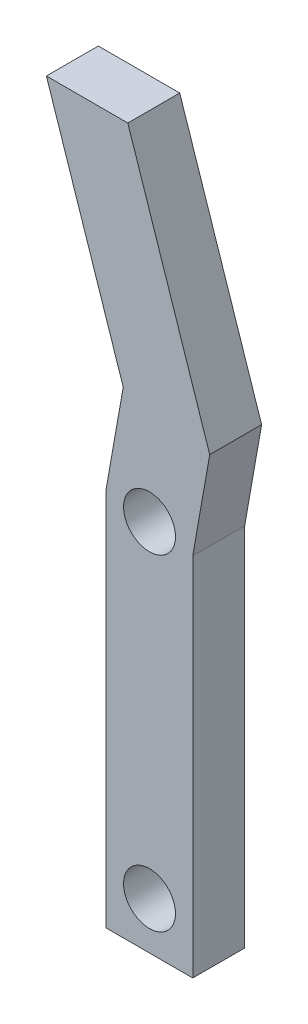
ISO-10303-21;
HEADER;
FILE_DESCRIPTION(('STEP AP214'),'2;1');
FILE_NAME('part.step','',(''),(''),'','','');
FILE_SCHEMA(('AUTOMOTIVE_DESIGN { 1 0 10303 214 1 1 1 1 }'));
ENDSEC;
DATA;
#1=APPLICATION_CONTEXT('core data for automotive mechanical design processes');
#2=APPLICATION_PROTOCOL_DEFINITION('international standard','automotive_design',2000,#1);
#3=PRODUCT_CONTEXT('',#1,'mechanical');
#4=PRODUCT('Part','Part','',(#3));
#5=PRODUCT_RELATED_PRODUCT_CATEGORY('part','',(#4));
#6=PRODUCT_DEFINITION_FORMATION('','',#4);
#7=PRODUCT_DEFINITION_CONTEXT('part definition',#1,'design');
#8=PRODUCT_DEFINITION('design','',#6,#7);
#9=PRODUCT_DEFINITION_SHAPE('','',#8);
#10=(LENGTH_UNIT() NAMED_UNIT(*) SI_UNIT(.MILLI.,.METRE.));
#11=(NAMED_UNIT(*) PLANE_ANGLE_UNIT() SI_UNIT($,.RADIAN.));
#12=(NAMED_UNIT(*) SI_UNIT($,.STERADIAN.) SOLID_ANGLE_UNIT());
#13=UNCERTAINTY_MEASURE_WITH_UNIT(LENGTH_MEASURE(1.E-05),#10,'distance_accuracy_value','');
#14=(GEOMETRIC_REPRESENTATION_CONTEXT(3) GLOBAL_UNCERTAINTY_ASSIGNED_CONTEXT((#13)) GLOBAL_UNIT_ASSIGNED_CONTEXT((#10,
#11,#12)) REPRESENTATION_CONTEXT('',''));
#15=CARTESIAN_POINT('',(0.,0.,0.));
#16=DIRECTION('',(0.,0.,1.));
#17=DIRECTION('',(1.,0.,0.));
#18=AXIS2_PLACEMENT_3D('',#15,#16,#17);
#19=CARTESIAN_POINT('',(0.,0.,3.));
#20=DIRECTION('',(0.,0.,1.));
#21=DIRECTION('',(1.,0.,0.));
#22=AXIS2_PLACEMENT_3D('',#19,#20,#21);
#23=PLANE('',#22);
#24=CARTESIAN_POINT('',(2.5,2.72444415808687,3.));
#25=DIRECTION('',(0.,0.,1.));
#26=DIRECTION('',(1.,0.,0.));
#27=AXIS2_PLACEMENT_3D('',#24,#25,#26);
#28=CIRCLE('',#27,1.5);
#29=CARTESIAN_POINT('',(4.,2.72444415808687,3.));
#30=VERTEX_POINT('',#29);
#31=EDGE_CURVE('E140',#30,#30,#28,.T.);
#32=ORIENTED_EDGE('',*,*,#31,.F.);
#33=EDGE_LOOP('',(#32));
#34=FACE_BOUND('',#33,.T.);
#35=DIRECTION('',(0.,-1.,0.));
#36=VECTOR('',#35,1.);
#37=CARTESIAN_POINT('',(0.,0.,3.));
#38=LINE('',#37,#36);
#39=CARTESIAN_POINT('',(0.,22.,3.));
#40=VERTEX_POINT('',#39);
#41=CARTESIAN_POINT('',(0.,0.,3.));
#42=VERTEX_POINT('',#41);
#43=EDGE_CURVE('E151',#40,#42,#38,.T.);
#44=ORIENTED_EDGE('',*,*,#43,.T.);
#45=DIRECTION('',(1.,0.,0.));
#46=VECTOR('',#45,1.);
#47=CARTESIAN_POINT('',(0.,0.,3.));
#48=LINE('',#47,#46);
#49=CARTESIAN_POINT('',(5.,0.,3.));
#50=VERTEX_POINT('',#49);
#51=EDGE_CURVE('E99',#42,#50,#48,.T.);
#52=ORIENTED_EDGE('',*,*,#51,.T.);
#53=DIRECTION('',(0.,1.,0.));
#54=VECTOR('',#53,1.);
#55=CARTESIAN_POINT('',(5.,0.,3.));
#56=LINE('',#55,#54);
#57=CARTESIAN_POINT('',(5.,21.1275355700729,3.));
#58=VERTEX_POINT('',#57);
#59=EDGE_CURVE('E166',#50,#58,#56,.T.);
#60=ORIENTED_EDGE('',*,*,#59,.T.);
#61=DIRECTION('',(0.173648177666923,0.984807753012209,0.));
#62=VECTOR('',#61,1.);
#63=CARTESIAN_POINT('',(5.98037801273902,26.6875355700729,3.));
#64=LINE('',#63,#62);
#65=CARTESIAN_POINT('',(5.98037801273902,26.6875355700729,3.));
#66=VERTEX_POINT('',#65);
#67=EDGE_CURVE('E179',#58,#66,#64,.T.);
#68=ORIENTED_EDGE('',*,*,#67,.T.);
#69=DIRECTION('',(-0.315548549180051,0.948909433565904,0.));
#70=VECTOR('',#69,1.);
#71=CARTESIAN_POINT('',(5.98037801273902,26.6875355700729,3.));
#72=LINE('',#71,#70);
#73=CARTESIAN_POINT('',(1.24714977503826,40.9211770735615,3.));
#74=VERTEX_POINT('',#73);
#75=EDGE_CURVE('E118',#66,#74,#72,.T.);
#76=ORIENTED_EDGE('',*,*,#75,.T.);
#77=DIRECTION('',(-1.,0.,0.));
#78=VECTOR('',#77,1.);
#79=CARTESIAN_POINT('',(1.24714977503826,40.9211770735615,3.));
#80=LINE('',#79,#78);
#81=CARTESIAN_POINT('',(-3.46008988293387,40.9211770735615,3.));
#82=VERTEX_POINT('',#81);
#83=EDGE_CURVE('E112',#74,#82,#80,.T.);
#84=ORIENTED_EDGE('',*,*,#83,.T.);
#85=DIRECTION('',(0.315548549180051,-0.948909433565904,0.));
#86=VECTOR('',#85,1.);
#87=CARTESIAN_POINT('',(0.980378012739025,27.5679168966425,3.));
#88=LINE('',#87,#86);
#89=CARTESIAN_POINT('',(0.980378012739025,27.5679168966425,3.));
#90=VERTEX_POINT('',#89);
#91=EDGE_CURVE('E116',#82,#90,#88,.T.);
#92=ORIENTED_EDGE('',*,*,#91,.T.);
#93=DIRECTION('',(-0.173408700949356,-0.984849949197875,0.));
#94=VECTOR('',#93,1.);
#95=CARTESIAN_POINT('',(0.,22.,3.));
#96=LINE('',#95,#94);
#97=EDGE_CURVE('E56',#90,#40,#96,.T.);
#98=ORIENTED_EDGE('',*,*,#97,.T.);
#99=EDGE_LOOP('',(#44,#52,#60,#68,#76,#84,#92,#98));
#100=FACE_BOUND('',#99,.T.);
#101=CARTESIAN_POINT('',(2.5,21.5844441580869,3.));
#102=DIRECTION('',(0.,0.,1.));
#103=DIRECTION('',(1.,0.,0.));
#104=AXIS2_PLACEMENT_3D('',#101,#102,#103);
#105=CIRCLE('',#104,1.5);
#106=CARTESIAN_POINT('',(4.00000000000001,21.5844441580869,3.));
#107=VERTEX_POINT('',#106);
#108=EDGE_CURVE('E188',#107,#107,#105,.T.);
#109=ORIENTED_EDGE('',*,*,#108,.F.);
#110=EDGE_LOOP('',(#109));
#111=FACE_BOUND('',#110,.T.);
#112=ADVANCED_FACE('F39',(#34,#100,#111),#23,.T.);
#113=CARTESIAN_POINT('',(0.,0.,0.));
#114=DIRECTION('',(0.,0.,1.));
#115=DIRECTION('',(1.,0.,0.));
#116=AXIS2_PLACEMENT_3D('',#113,#114,#115);
#117=PLANE('',#116);
#118=DIRECTION('',(0.,-1.,0.));
#119=VECTOR('',#118,1.);
#120=CARTESIAN_POINT('',(0.,0.,0.));
#121=LINE('',#120,#119);
#122=CARTESIAN_POINT('',(0.,22.,0.));
#123=VERTEX_POINT('',#122);
#124=CARTESIAN_POINT('',(0.,0.,0.));
#125=VERTEX_POINT('',#124);
#126=EDGE_CURVE('E136',#123,#125,#121,.T.);
#127=ORIENTED_EDGE('',*,*,#126,.F.);
#128=DIRECTION('',(-0.173408700949356,-0.984849949197875,0.));
#129=VECTOR('',#128,1.);
#130=CARTESIAN_POINT('',(0.,22.,0.));
#131=LINE('',#130,#129);
#132=CARTESIAN_POINT('',(0.980378012739025,27.5679168966425,0.));
#133=VERTEX_POINT('',#132);
#134=EDGE_CURVE('E91',#133,#123,#131,.T.);
#135=ORIENTED_EDGE('',*,*,#134,.F.);
#136=DIRECTION('',(0.315548549180051,-0.948909433565904,0.));
#137=VECTOR('',#136,1.);
#138=CARTESIAN_POINT('',(0.980378012739025,27.5679168966425,0.));
#139=LINE('',#138,#137);
#140=CARTESIAN_POINT('',(-3.46008988293387,40.9211770735615,0.));
#141=VERTEX_POINT('',#140);
#142=EDGE_CURVE('E85',#141,#133,#139,.T.);
#143=ORIENTED_EDGE('',*,*,#142,.F.);
#144=DIRECTION('',(-1.,0.,0.));
#145=VECTOR('',#144,1.);
#146=CARTESIAN_POINT('',(1.24714977503826,40.9211770735615,0.));
#147=LINE('',#146,#145);
#148=CARTESIAN_POINT('',(1.24714977503826,40.9211770735615,0.));
#149=VERTEX_POINT('',#148);
#150=EDGE_CURVE('E126',#149,#141,#147,.T.);
#151=ORIENTED_EDGE('',*,*,#150,.F.);
#152=DIRECTION('',(-0.315548549180051,0.948909433565904,0.));
#153=VECTOR('',#152,1.);
#154=CARTESIAN_POINT('',(5.98037801273902,26.6875355700729,0.));
#155=LINE('',#154,#153);
#156=CARTESIAN_POINT('',(5.98037801273902,26.6875355700729,0.));
#157=VERTEX_POINT('',#156);
#158=EDGE_CURVE('E146',#157,#149,#155,.T.);
#159=ORIENTED_EDGE('',*,*,#158,.F.);
#160=DIRECTION('',(0.173648177666923,0.984807753012209,0.));
#161=VECTOR('',#160,1.);
#162=CARTESIAN_POINT('',(5.98037801273902,26.6875355700729,0.));
#163=LINE('',#162,#161);
#164=CARTESIAN_POINT('',(5.,21.1275355700729,0.));
#165=VERTEX_POINT('',#164);
#166=EDGE_CURVE('E144',#165,#157,#163,.T.);
#167=ORIENTED_EDGE('',*,*,#166,.F.);
#168=DIRECTION('',(0.,1.,0.));
#169=VECTOR('',#168,1.);
#170=CARTESIAN_POINT('',(5.,0.,0.));
#171=LINE('',#170,#169);
#172=CARTESIAN_POINT('',(5.,0.,0.));
#173=VERTEX_POINT('',#172);
#174=EDGE_CURVE('E142',#173,#165,#171,.T.);
#175=ORIENTED_EDGE('',*,*,#174,.F.);
#176=DIRECTION('',(1.,0.,0.));
#177=VECTOR('',#176,1.);
#178=CARTESIAN_POINT('',(0.,0.,0.));
#179=LINE('',#178,#177);
#180=EDGE_CURVE('E139',#125,#173,#179,.T.);
#181=ORIENTED_EDGE('',*,*,#180,.F.);
#182=EDGE_LOOP('',(#127,#135,#143,#151,#159,#167,#175,#181));
#183=FACE_BOUND('',#182,.T.);
#184=CARTESIAN_POINT('',(2.5,2.72444415808687,0.));
#185=DIRECTION('',(0.,0.,1.));
#186=DIRECTION('',(1.,0.,0.));
#187=AXIS2_PLACEMENT_3D('',#184,#185,#186);
#188=CIRCLE('',#187,1.5);
#189=CARTESIAN_POINT('',(4.,2.72444415808687,0.));
#190=VERTEX_POINT('',#189);
#191=EDGE_CURVE('E185',#190,#190,#188,.T.);
#192=ORIENTED_EDGE('',*,*,#191,.T.);
#193=EDGE_LOOP('',(#192));
#194=FACE_BOUND('',#193,.T.);
#195=CARTESIAN_POINT('',(2.5,21.5844441580869,0.));
#196=DIRECTION('',(0.,0.,1.));
#197=DIRECTION('',(1.,0.,0.));
#198=AXIS2_PLACEMENT_3D('',#195,#196,#197);
#199=CIRCLE('',#198,1.5);
#200=CARTESIAN_POINT('',(4.00000000000001,21.5844441580869,0.));
#201=VERTEX_POINT('',#200);
#202=EDGE_CURVE('E191',#201,#201,#199,.T.);
#203=ORIENTED_EDGE('',*,*,#202,.T.);
#204=EDGE_LOOP('',(#203));
#205=FACE_BOUND('',#204,.T.);
#206=ADVANCED_FACE('F170',(#183,#194,#205),#117,.F.);
#207=CARTESIAN_POINT('',(0.,0.,3.));
#208=DIRECTION('',(1.,0.,0.));
#209=DIRECTION('',(0.,1.,0.));
#210=AXIS2_PLACEMENT_3D('',#207,#208,#209);
#211=PLANE('',#210);
#212=ORIENTED_EDGE('',*,*,#126,.T.);
#213=DIRECTION('',(0.,0.,-1.));
#214=VECTOR('',#213,1.);
#215=CARTESIAN_POINT('',(0.,0.,3.));
#216=LINE('',#215,#214);
#217=EDGE_CURVE('E11',#42,#125,#216,.T.);
#218=ORIENTED_EDGE('',*,*,#217,.F.);
#219=ORIENTED_EDGE('',*,*,#43,.F.);
#220=DIRECTION('',(0.,0.,-1.));
#221=VECTOR('',#220,1.);
#222=CARTESIAN_POINT('',(0.,22.,3.));
#223=LINE('',#222,#221);
#224=EDGE_CURVE('E132',#40,#123,#223,.T.);
#225=ORIENTED_EDGE('',*,*,#224,.T.);
#226=EDGE_LOOP('',(#212,#218,#219,#225));
#227=FACE_BOUND('',#226,.T.);
#228=ADVANCED_FACE('F41',(#227),#211,.F.);
#229=CARTESIAN_POINT('',(0.,0.,3.));
#230=DIRECTION('',(0.,1.,0.));
#231=DIRECTION('',(0.,0.,1.));
#232=AXIS2_PLACEMENT_3D('',#229,#230,#231);
#233=PLANE('',#232);
#234=ORIENTED_EDGE('',*,*,#180,.T.);
#235=DIRECTION('',(0.,0.,-1.));
#236=VECTOR('',#235,1.);
#237=CARTESIAN_POINT('',(5.,0.,3.));
#238=LINE('',#237,#236);
#239=EDGE_CURVE('E48',#50,#173,#238,.T.);
#240=ORIENTED_EDGE('',*,*,#239,.F.);
#241=ORIENTED_EDGE('',*,*,#51,.F.);
#242=ORIENTED_EDGE('',*,*,#217,.T.);
#243=EDGE_LOOP('',(#234,#240,#241,#242));
#244=FACE_BOUND('',#243,.T.);
#245=ADVANCED_FACE('F223',(#244),#233,.F.);
#246=CARTESIAN_POINT('',(5.,0.,3.));
#247=DIRECTION('',(-1.,0.,0.));
#248=DIRECTION('',(0.,0.,1.));
#249=AXIS2_PLACEMENT_3D('',#246,#247,#248);
#250=PLANE('',#249);
#251=ORIENTED_EDGE('',*,*,#174,.T.);
#252=DIRECTION('',(0.,0.,-1.));
#253=VECTOR('',#252,1.);
#254=CARTESIAN_POINT('',(5.,21.1275355700729,3.));
#255=LINE('',#254,#253);
#256=EDGE_CURVE('E158',#58,#165,#255,.T.);
#257=ORIENTED_EDGE('',*,*,#256,.F.);
#258=ORIENTED_EDGE('',*,*,#59,.F.);
#259=ORIENTED_EDGE('',*,*,#239,.T.);
#260=EDGE_LOOP('',(#251,#257,#258,#259));
#261=FACE_BOUND('',#260,.T.);
#262=ADVANCED_FACE('F164',(#261),#250,.F.);
#263=CARTESIAN_POINT('',(5.98037801273902,26.6875355700729,3.));
#264=DIRECTION('',(-0.984807753012209,0.173648177666923,0.));
#265=DIRECTION('',(-0.173648177666923,-0.984807753012209,0.));
#266=AXIS2_PLACEMENT_3D('',#263,#264,#265);
#267=PLANE('',#266);
#268=ORIENTED_EDGE('',*,*,#166,.T.);
#269=DIRECTION('',(0.,0.,-1.));
#270=VECTOR('',#269,1.);
#271=CARTESIAN_POINT('',(5.98037801273902,26.6875355700729,3.));
#272=LINE('',#271,#270);
#273=EDGE_CURVE('E155',#66,#157,#272,.T.);
#274=ORIENTED_EDGE('',*,*,#273,.F.);
#275=ORIENTED_EDGE('',*,*,#67,.F.);
#276=ORIENTED_EDGE('',*,*,#256,.T.);
#277=EDGE_LOOP('',(#268,#274,#275,#276));
#278=FACE_BOUND('',#277,.T.);
#279=ADVANCED_FACE('F175',(#278),#267,.F.);
#280=CARTESIAN_POINT('',(5.98037801273902,26.6875355700729,3.));
#281=DIRECTION('',(-0.948909433565904,-0.315548549180051,0.));
#282=DIRECTION('',(0.315548549180051,-0.948909433565904,0.));
#283=AXIS2_PLACEMENT_3D('',#280,#281,#282);
#284=PLANE('',#283);
#285=ORIENTED_EDGE('',*,*,#158,.T.);
#286=DIRECTION('',(0.,0.,-1.));
#287=VECTOR('',#286,1.);
#288=CARTESIAN_POINT('',(1.24714977503826,40.9211770735615,3.));
#289=LINE('',#288,#287);
#290=EDGE_CURVE('E127',#74,#149,#289,.T.);
#291=ORIENTED_EDGE('',*,*,#290,.F.);
#292=ORIENTED_EDGE('',*,*,#75,.F.);
#293=ORIENTED_EDGE('',*,*,#273,.T.);
#294=EDGE_LOOP('',(#285,#291,#292,#293));
#295=FACE_BOUND('',#294,.T.);
#296=ADVANCED_FACE('F178',(#295),#284,.F.);
#297=CARTESIAN_POINT('',(1.24714977503826,40.9211770735615,3.));
#298=DIRECTION('',(0.,-1.,0.));
#299=DIRECTION('',(0.,0.,-1.));
#300=AXIS2_PLACEMENT_3D('',#297,#298,#299);
#301=PLANE('',#300);
#302=ORIENTED_EDGE('',*,*,#150,.T.);
#303=DIRECTION('',(0.,0.,-1.));
#304=VECTOR('',#303,1.);
#305=CARTESIAN_POINT('',(-3.46008988293387,40.9211770735615,3.));
#306=LINE('',#305,#304);
#307=EDGE_CURVE('E123',#82,#141,#306,.T.);
#308=ORIENTED_EDGE('',*,*,#307,.F.);
#309=ORIENTED_EDGE('',*,*,#83,.F.);
#310=ORIENTED_EDGE('',*,*,#290,.T.);
#311=EDGE_LOOP('',(#302,#308,#309,#310));
#312=FACE_BOUND('',#311,.T.);
#313=ADVANCED_FACE('F124',(#312),#301,.F.);
#314=CARTESIAN_POINT('',(0.980378012739025,27.5679168966425,3.));
#315=DIRECTION('',(0.948909433565904,0.315548549180051,0.));
#316=DIRECTION('',(-0.315548549180051,0.948909433565904,0.));
#317=AXIS2_PLACEMENT_3D('',#314,#315,#316);
#318=PLANE('',#317);
#319=ORIENTED_EDGE('',*,*,#142,.T.);
#320=DIRECTION('',(0.,0.,-1.));
#321=VECTOR('',#320,1.);
#322=CARTESIAN_POINT('',(0.980378012739025,27.5679168966425,3.));
#323=LINE('',#322,#321);
#324=EDGE_CURVE('E128',#90,#133,#323,.T.);
#325=ORIENTED_EDGE('',*,*,#324,.F.);
#326=ORIENTED_EDGE('',*,*,#91,.F.);
#327=ORIENTED_EDGE('',*,*,#307,.T.);
#328=EDGE_LOOP('',(#319,#325,#326,#327));
#329=FACE_BOUND('',#328,.T.);
#330=ADVANCED_FACE('F130',(#329),#318,.F.);
#331=CARTESIAN_POINT('',(0.,22.,3.));
#332=DIRECTION('',(0.984849949197875,-0.173408700949356,0.));
#333=DIRECTION('',(0.173408700949356,0.984849949197875,0.));
#334=AXIS2_PLACEMENT_3D('',#331,#332,#333);
#335=PLANE('',#334);
#336=ORIENTED_EDGE('',*,*,#134,.T.);
#337=ORIENTED_EDGE('',*,*,#224,.F.);
#338=ORIENTED_EDGE('',*,*,#97,.F.);
#339=ORIENTED_EDGE('',*,*,#324,.T.);
#340=EDGE_LOOP('',(#336,#337,#338,#339));
#341=FACE_BOUND('',#340,.T.);
#342=ADVANCED_FACE('F211',(#341),#335,.F.);
#343=CARTESIAN_POINT('',(2.5,2.72444415808687,3.));
#344=DIRECTION('',(0.,0.,-1.));
#345=DIRECTION('',(-1.,0.,0.));
#346=AXIS2_PLACEMENT_3D('',#343,#344,#345);
#347=CYLINDRICAL_SURFACE('',#346,1.5);
#348=ORIENTED_EDGE('',*,*,#31,.T.);
#349=EDGE_LOOP('',(#348));
#350=FACE_BOUND('',#349,.T.);
#351=ORIENTED_EDGE('',*,*,#191,.F.);
#352=EDGE_LOOP('',(#351));
#353=FACE_BOUND('',#352,.T.);
#354=ADVANCED_FACE('F208',(#350,#353),#347,.F.);
#355=CARTESIAN_POINT('',(2.5,21.5844441580869,3.));
#356=DIRECTION('',(0.,0.,-1.));
#357=DIRECTION('',(-1.,0.,0.));
#358=AXIS2_PLACEMENT_3D('',#355,#356,#357);
#359=CYLINDRICAL_SURFACE('',#358,1.5);
#360=ORIENTED_EDGE('',*,*,#108,.T.);
#361=EDGE_LOOP('',(#360));
#362=FACE_BOUND('',#361,.T.);
#363=ORIENTED_EDGE('',*,*,#202,.F.);
#364=EDGE_LOOP('',(#363));
#365=FACE_BOUND('',#364,.T.);
#366=ADVANCED_FACE('F197',(#362,#365),#359,.F.);
#367=CLOSED_SHELL('',(#112,#206,#228,#245,#262,#279,#296,#313,#330,#342,#354,#366));
#368=MANIFOLD_SOLID_BREP('B2',#367);
#369=ADVANCED_BREP_SHAPE_REPRESENTATION('',(#18,#368),#14);
#370=SHAPE_DEFINITION_REPRESENTATION(#9,#369);
ENDSEC;
END-ISO-10303-21;
